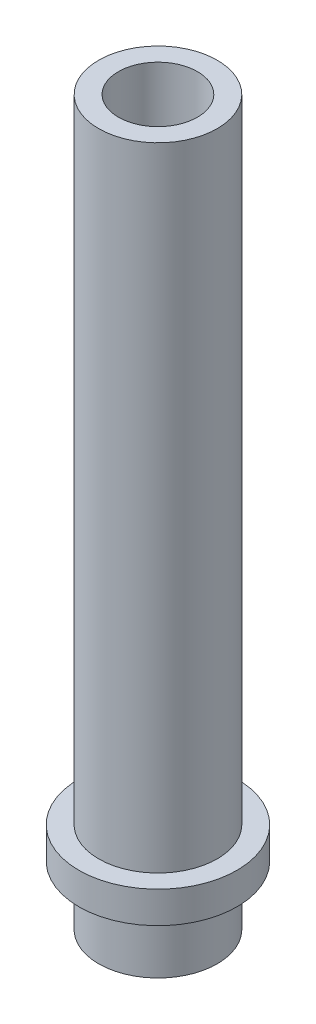
ISO-10303-21;
HEADER;
FILE_DESCRIPTION(('STEP AP214'),'2;1');
FILE_NAME('part.step','',(''),(''),'','','');
FILE_SCHEMA(('AUTOMOTIVE_DESIGN { 1 0 10303 214 1 1 1 1 }'));
ENDSEC;
DATA;
#1=APPLICATION_CONTEXT('core data for automotive mechanical design processes');
#2=APPLICATION_PROTOCOL_DEFINITION('international standard','automotive_design',2000,#1);
#3=PRODUCT_CONTEXT('',#1,'mechanical');
#4=PRODUCT('Part','Part','',(#3));
#5=PRODUCT_RELATED_PRODUCT_CATEGORY('part','',(#4));
#6=PRODUCT_DEFINITION_FORMATION('','',#4);
#7=PRODUCT_DEFINITION_CONTEXT('part definition',#1,'design');
#8=PRODUCT_DEFINITION('design','',#6,#7);
#9=PRODUCT_DEFINITION_SHAPE('','',#8);
#10=(LENGTH_UNIT() NAMED_UNIT(*) SI_UNIT(.MILLI.,.METRE.));
#11=(NAMED_UNIT(*) PLANE_ANGLE_UNIT() SI_UNIT($,.RADIAN.));
#12=(NAMED_UNIT(*) SI_UNIT($,.STERADIAN.) SOLID_ANGLE_UNIT());
#13=UNCERTAINTY_MEASURE_WITH_UNIT(LENGTH_MEASURE(1.E-05),#10,'distance_accuracy_value','');
#14=(GEOMETRIC_REPRESENTATION_CONTEXT(3) GLOBAL_UNCERTAINTY_ASSIGNED_CONTEXT((#13)) GLOBAL_UNIT_ASSIGNED_CONTEXT((#10,
#11,#12)) REPRESENTATION_CONTEXT('',''));
#15=CARTESIAN_POINT('',(0.,0.,0.));
#16=DIRECTION('',(0.,0.,1.));
#17=DIRECTION('',(1.,0.,0.));
#18=AXIS2_PLACEMENT_3D('',#15,#16,#17);
#19=CARTESIAN_POINT('',(0.,2.54,0.));
#20=DIRECTION('',(0.,-1.,0.));
#21=DIRECTION('',(0.,0.,-1.));
#22=AXIS2_PLACEMENT_3D('',#19,#20,#21);
#23=CYLINDRICAL_SURFACE('',#22,6.35);
#24=CARTESIAN_POINT('',(0.,2.54,0.));
#25=DIRECTION('',(0.,1.,0.));
#26=DIRECTION('',(0.,0.,1.));
#27=AXIS2_PLACEMENT_3D('',#24,#25,#26);
#28=CIRCLE('',#27,6.35);
#29=CARTESIAN_POINT('',(0.,2.54,6.35));
#30=VERTEX_POINT('',#29);
#31=EDGE_CURVE('E47',#30,#30,#28,.T.);
#32=ORIENTED_EDGE('',*,*,#31,.F.);
#33=EDGE_LOOP('',(#32));
#34=FACE_BOUND('',#33,.T.);
#35=CARTESIAN_POINT('',(0.,0.,0.));
#36=DIRECTION('',(0.,1.,0.));
#37=DIRECTION('',(0.,0.,1.));
#38=AXIS2_PLACEMENT_3D('',#35,#36,#37);
#39=CIRCLE('',#38,6.35);
#40=CARTESIAN_POINT('',(0.,0.,6.35));
#41=VERTEX_POINT('',#40);
#42=EDGE_CURVE('E38',#41,#41,#39,.T.);
#43=ORIENTED_EDGE('',*,*,#42,.T.);
#44=EDGE_LOOP('',(#43));
#45=FACE_BOUND('',#44,.T.);
#46=ADVANCED_FACE('F35',(#34,#45),#23,.T.);
#47=CARTESIAN_POINT('',(0.,2.54,0.));
#48=DIRECTION('',(0.,1.,0.));
#49=DIRECTION('',(0.,0.,1.));
#50=AXIS2_PLACEMENT_3D('',#47,#48,#49);
#51=PLANE('',#50);
#52=CARTESIAN_POINT('',(0.,2.54,0.));
#53=DIRECTION('',(0.,1.,0.));
#54=DIRECTION('',(0.,0.,1.));
#55=AXIS2_PLACEMENT_3D('',#52,#53,#54);
#56=CIRCLE('',#55,4.7625);
#57=CARTESIAN_POINT('',(0.,2.54,4.7625));
#58=VERTEX_POINT('',#57);
#59=EDGE_CURVE('E10',#58,#58,#56,.T.);
#60=ORIENTED_EDGE('',*,*,#59,.F.);
#61=EDGE_LOOP('',(#60));
#62=FACE_BOUND('',#61,.T.);
#63=ORIENTED_EDGE('',*,*,#31,.T.);
#64=EDGE_LOOP('',(#63));
#65=FACE_BOUND('',#64,.T.);
#66=ADVANCED_FACE('F65',(#62,#65),#51,.T.);
#67=CARTESIAN_POINT('',(0.,0.,0.));
#68=DIRECTION('',(0.,1.,0.));
#69=DIRECTION('',(0.,0.,1.));
#70=AXIS2_PLACEMENT_3D('',#67,#68,#69);
#71=PLANE('',#70);
#72=CARTESIAN_POINT('',(0.,0.,0.));
#73=DIRECTION('',(0.,-1.,0.));
#74=DIRECTION('',(0.,0.,-1.));
#75=AXIS2_PLACEMENT_3D('',#72,#73,#74);
#76=CIRCLE('',#75,4.7625);
#77=CARTESIAN_POINT('',(0.,0.,4.7625));
#78=VERTEX_POINT('',#77);
#79=EDGE_CURVE('E42',#78,#78,#76,.T.);
#80=ORIENTED_EDGE('',*,*,#79,.F.);
#81=EDGE_LOOP('',(#80));
#82=FACE_BOUND('',#81,.T.);
#83=ORIENTED_EDGE('',*,*,#42,.F.);
#84=EDGE_LOOP('',(#83));
#85=FACE_BOUND('',#84,.T.);
#86=ADVANCED_FACE('F62',(#82,#85),#71,.F.);
#87=CARTESIAN_POINT('',(0.,-4.7625,0.));
#88=DIRECTION('',(0.,1.,0.));
#89=DIRECTION('',(0.,0.,1.));
#90=AXIS2_PLACEMENT_3D('',#87,#88,#89);
#91=CYLINDRICAL_SURFACE('',#90,4.7625);
#92=CARTESIAN_POINT('',(0.,-4.7625,0.));
#93=DIRECTION('',(0.,-1.,0.));
#94=DIRECTION('',(0.,0.,-1.));
#95=AXIS2_PLACEMENT_3D('',#92,#93,#94);
#96=CIRCLE('',#95,4.7625);
#97=CARTESIAN_POINT('',(0.,-4.7625,4.7625));
#98=VERTEX_POINT('',#97);
#99=EDGE_CURVE('E53',#98,#98,#96,.T.);
#100=CARTESIAN_POINT('',(0.,-4.7625,4.7625));
#101=CARTESIAN_POINT('',(0.,-4.712890625,4.7625));
#102=CARTESIAN_POINT('',(0.,-4.66328125,4.7625));
#103=CARTESIAN_POINT('',(0.,-4.5640625,4.7625));
#104=CARTESIAN_POINT('',(0.,-4.514453125,4.7625));
#105=CARTESIAN_POINT('',(0.,-4.415234375,4.7625));
#106=CARTESIAN_POINT('',(0.,-4.365625,4.7625));
#107=CARTESIAN_POINT('',(0.,-4.26640625,4.7625));
#108=CARTESIAN_POINT('',(0.,-4.216796875,4.7625));
#109=CARTESIAN_POINT('',(0.,-4.117578125,4.7625));
#110=CARTESIAN_POINT('',(0.,-4.06796875,4.7625));
#111=CARTESIAN_POINT('',(0.,-3.96875,4.7625));
#112=CARTESIAN_POINT('',(0.,-3.919140625,4.7625));
#113=CARTESIAN_POINT('',(0.,-3.819921875,4.7625));
#114=CARTESIAN_POINT('',(0.,-3.7703125,4.7625));
#115=CARTESIAN_POINT('',(0.,-3.67109375,4.7625));
#116=CARTESIAN_POINT('',(0.,-3.621484375,4.7625));
#117=CARTESIAN_POINT('',(0.,-3.522265625,4.7625));
#118=CARTESIAN_POINT('',(0.,-3.47265625,4.7625));
#119=CARTESIAN_POINT('',(0.,-3.3734375,4.7625));
#120=CARTESIAN_POINT('',(0.,-3.323828125,4.7625));
#121=CARTESIAN_POINT('',(0.,-3.224609375,4.7625));
#122=CARTESIAN_POINT('',(0.,-3.175,4.7625));
#123=CARTESIAN_POINT('',(0.,-3.07578125,4.7625));
#124=CARTESIAN_POINT('',(0.,-3.026171875,4.7625));
#125=CARTESIAN_POINT('',(0.,-2.926953125,4.7625));
#126=CARTESIAN_POINT('',(0.,-2.87734375,4.7625));
#127=CARTESIAN_POINT('',(0.,-2.778125,4.7625));
#128=CARTESIAN_POINT('',(0.,-2.728515625,4.7625));
#129=CARTESIAN_POINT('',(0.,-2.629296875,4.7625));
#130=CARTESIAN_POINT('',(0.,-2.5796875,4.7625));
#131=CARTESIAN_POINT('',(0.,-2.48046875,4.7625));
#132=CARTESIAN_POINT('',(0.,-2.430859375,4.7625));
#133=CARTESIAN_POINT('',(0.,-2.331640625,4.7625));
#134=CARTESIAN_POINT('',(0.,-2.28203125,4.7625));
#135=CARTESIAN_POINT('',(0.,-2.1828125,4.7625));
#136=CARTESIAN_POINT('',(0.,-2.133203125,4.7625));
#137=CARTESIAN_POINT('',(0.,-2.033984375,4.7625));
#138=CARTESIAN_POINT('',(0.,-1.984375,4.7625));
#139=CARTESIAN_POINT('',(0.,-1.88515625,4.7625));
#140=CARTESIAN_POINT('',(0.,-1.835546875,4.7625));
#141=CARTESIAN_POINT('',(0.,-1.736328125,4.7625));
#142=CARTESIAN_POINT('',(0.,-1.68671875,4.7625));
#143=CARTESIAN_POINT('',(0.,-1.5875,4.7625));
#144=CARTESIAN_POINT('',(0.,-1.537890625,4.7625));
#145=CARTESIAN_POINT('',(0.,-1.438671875,4.7625));
#146=CARTESIAN_POINT('',(0.,-1.3890625,4.7625));
#147=CARTESIAN_POINT('',(0.,-1.28984375,4.7625));
#148=CARTESIAN_POINT('',(0.,-1.240234375,4.7625));
#149=CARTESIAN_POINT('',(0.,-1.141015625,4.7625));
#150=CARTESIAN_POINT('',(0.,-1.09140625,4.7625));
#151=CARTESIAN_POINT('',(0.,-0.992187499999999,4.7625));
#152=CARTESIAN_POINT('',(0.,-0.942578124999999,4.7625));
#153=CARTESIAN_POINT('',(0.,-0.843359375,4.7625));
#154=CARTESIAN_POINT('',(0.,-0.79375,4.7625));
#155=CARTESIAN_POINT('',(0.,-0.69453125,4.7625));
#156=CARTESIAN_POINT('',(0.,-0.644921875,4.7625));
#157=CARTESIAN_POINT('',(0.,-0.545703125,4.7625));
#158=CARTESIAN_POINT('',(0.,-0.49609375,4.7625));
#159=CARTESIAN_POINT('',(0.,-0.396875,4.7625));
#160=CARTESIAN_POINT('',(0.,-0.347265625,4.7625));
#161=CARTESIAN_POINT('',(0.,-0.248046875,4.7625));
#162=CARTESIAN_POINT('',(0.,-0.1984375,4.7625));
#163=CARTESIAN_POINT('',(0.,-0.09921875,4.7625));
#164=CARTESIAN_POINT('',(0.,-0.049609375,4.7625));
#165=CARTESIAN_POINT('',(0.,0.,4.7625));
#166=B_SPLINE_CURVE_WITH_KNOTS('',3,(#100,#101,#102,#103,#104,#105,#106,#107,#108,#109,#110,
#111,#112,#113,#114,#115,#116,#117,#118,#119,#120,#121,#122,#123,#124,#125,#126,#127,#128,#129,
#130,#131,#132,#133,#134,#135,#136,#137,#138,#139,#140,#141,#142,#143,#144,#145,#146,#147,#148,
#149,#150,#151,#152,#153,#154,#155,#156,#157,#158,#159,#160,#161,#162,#163,#164,#165),
.UNSPECIFIED.,.F.,.F.,(4,2,2,2,2,2,2,2,2,2,2,2,2,2,2,2,2,2,2,2,2,2,2,2,2,2,2,2,2,2,2,2,4),(0.,
0.148828125,0.29765625,0.446484375,0.5953125,0.744140625,0.892968750000001,1.041796875,1.190625,
1.339453125,1.48828125,1.637109375,1.7859375,1.934765625,2.08359375,2.232421875,2.38125,
2.530078125,2.67890625,2.827734375,2.9765625,3.125390625,3.27421875,3.423046875,3.571875,
3.720703125,3.86953125,4.018359375,4.1671875,4.316015625,4.46484375,4.613671875,4.7625),.UNSPECIFIED.);
#167=EDGE_CURVE('BSEAM64',#98,#78,#166,.T.);
#168=ORIENTED_EDGE('',*,*,#99,.F.);
#169=ORIENTED_EDGE('',*,*,#79,.T.);
#170=ORIENTED_EDGE('',*,*,#167,.T.);
#171=ORIENTED_EDGE('',*,*,#167,.F.);
#172=EDGE_LOOP('',(#168,#170,#169,#171));
#173=FACE_BOUND('',#172,.T.);
#174=ADVANCED_FACE('F64',(#173),#91,.T.);
#175=CARTESIAN_POINT('',(0.,-4.7625,0.));
#176=DIRECTION('',(0.,-1.,0.));
#177=DIRECTION('',(0.,0.,-1.));
#178=AXIS2_PLACEMENT_3D('',#175,#176,#177);
#179=PLANE('',#178);
#180=ORIENTED_EDGE('',*,*,#99,.T.);
#181=EDGE_LOOP('',(#180));
#182=FACE_BOUND('',#181,.T.);
#183=ADVANCED_FACE('F71',(#182),#179,.T.);
#184=CARTESIAN_POINT('',(0.,53.34,0.));
#185=DIRECTION('',(0.,-1.,0.));
#186=DIRECTION('',(0.,0.,-1.));
#187=AXIS2_PLACEMENT_3D('',#184,#185,#186);
#188=CYLINDRICAL_SURFACE('',#187,4.7625);
#189=CARTESIAN_POINT('',(0.,53.34,0.));
#190=DIRECTION('',(0.,1.,0.));
#191=DIRECTION('',(0.,0.,1.));
#192=AXIS2_PLACEMENT_3D('',#189,#190,#191);
#193=CIRCLE('',#192,4.7625);
#194=CARTESIAN_POINT('',(0.,53.34,4.7625));
#195=VERTEX_POINT('',#194);
#196=EDGE_CURVE('E51',#195,#195,#193,.T.);
#197=ORIENTED_EDGE('',*,*,#196,.F.);
#198=EDGE_LOOP('',(#197));
#199=FACE_BOUND('',#198,.T.);
#200=ORIENTED_EDGE('',*,*,#59,.T.);
#201=EDGE_LOOP('',(#200));
#202=FACE_BOUND('',#201,.T.);
#203=ADVANCED_FACE('F96',(#199,#202),#188,.T.);
#204=CARTESIAN_POINT('',(0.,53.34,0.));
#205=DIRECTION('',(0.,1.,0.));
#206=DIRECTION('',(0.,0.,1.));
#207=AXIS2_PLACEMENT_3D('',#204,#205,#206);
#208=PLANE('',#207);
#209=CARTESIAN_POINT('',(0.,53.34,0.));
#210=DIRECTION('',(0.,1.,0.));
#211=DIRECTION('',(0.,0.,1.));
#212=AXIS2_PLACEMENT_3D('',#209,#210,#211);
#213=CIRCLE('',#212,3.175);
#214=CARTESIAN_POINT('',(0.,53.34,3.175));
#215=VERTEX_POINT('',#214);
#216=EDGE_CURVE('E153',#215,#215,#213,.T.);
#217=ORIENTED_EDGE('',*,*,#216,.F.);
#218=EDGE_LOOP('',(#217));
#219=FACE_BOUND('',#218,.T.);
#220=ORIENTED_EDGE('',*,*,#196,.T.);
#221=EDGE_LOOP('',(#220));
#222=FACE_BOUND('',#221,.T.);
#223=ADVANCED_FACE('F101',(#219,#222),#208,.T.);
#224=CARTESIAN_POINT('',(0.,27.94,0.));
#225=DIRECTION('',(0.,1.,0.));
#226=DIRECTION('',(0.,0.,1.));
#227=AXIS2_PLACEMENT_3D('',#224,#225,#226);
#228=CYLINDRICAL_SURFACE('',#227,3.175);
#229=CARTESIAN_POINT('',(0.,27.94,0.));
#230=DIRECTION('',(0.,1.,0.));
#231=DIRECTION('',(0.,0.,1.));
#232=AXIS2_PLACEMENT_3D('',#229,#230,#231);
#233=CIRCLE('',#232,3.175);
#234=CARTESIAN_POINT('',(0.,27.94,3.175));
#235=VERTEX_POINT('',#234);
#236=EDGE_CURVE('E152',#235,#235,#233,.T.);
#237=ORIENTED_EDGE('',*,*,#236,.F.);
#238=EDGE_LOOP('',(#237));
#239=FACE_BOUND('',#238,.T.);
#240=ORIENTED_EDGE('',*,*,#216,.T.);
#241=EDGE_LOOP('',(#240));
#242=FACE_BOUND('',#241,.T.);
#243=ADVANCED_FACE('F111',(#239,#242),#228,.F.);
#244=CARTESIAN_POINT('',(0.,27.94,0.));
#245=DIRECTION('',(0.,1.,0.));
#246=DIRECTION('',(0.,0.,1.));
#247=AXIS2_PLACEMENT_3D('',#244,#245,#246);
#248=PLANE('',#247);
#249=ORIENTED_EDGE('',*,*,#236,.T.);
#250=EDGE_LOOP('',(#249));
#251=FACE_BOUND('',#250,.T.);
#252=ADVANCED_FACE('F121',(#251),#248,.T.);
#253=CLOSED_SHELL('',(#46,#66,#86,#174,#183,#203,#223,#243,#252));
#254=MANIFOLD_SOLID_BREP('B2',#253);
#255=ADVANCED_BREP_SHAPE_REPRESENTATION('',(#18,#254),#14);
#256=SHAPE_DEFINITION_REPRESENTATION(#9,#255);
ENDSEC;
END-ISO-10303-21;
